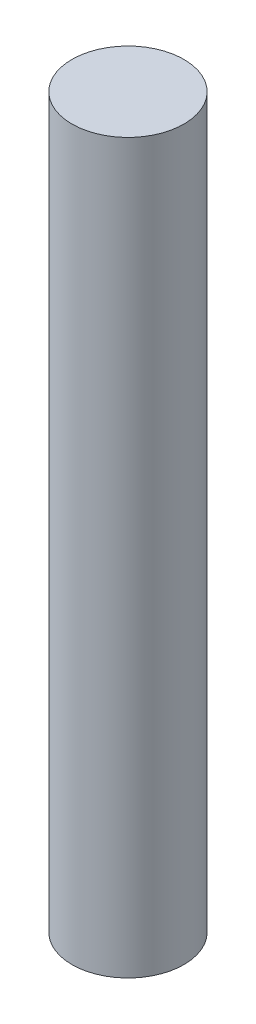
ISO-10303-21;
HEADER;
FILE_DESCRIPTION(('STEP AP214'),'2;1');
FILE_NAME('part.step','',(''),(''),'','','');
FILE_SCHEMA(('AUTOMOTIVE_DESIGN { 1 0 10303 214 1 1 1 1 }'));
ENDSEC;
DATA;
#1=APPLICATION_CONTEXT('core data for automotive mechanical design processes');
#2=APPLICATION_PROTOCOL_DEFINITION('international standard','automotive_design',2000,#1);
#3=PRODUCT_CONTEXT('',#1,'mechanical');
#4=PRODUCT('Part','Part','',(#3));
#5=PRODUCT_RELATED_PRODUCT_CATEGORY('part','',(#4));
#6=PRODUCT_DEFINITION_FORMATION('','',#4);
#7=PRODUCT_DEFINITION_CONTEXT('part definition',#1,'design');
#8=PRODUCT_DEFINITION('design','',#6,#7);
#9=PRODUCT_DEFINITION_SHAPE('','',#8);
#10=(LENGTH_UNIT() NAMED_UNIT(*) SI_UNIT(.MILLI.,.METRE.));
#11=(NAMED_UNIT(*) PLANE_ANGLE_UNIT() SI_UNIT($,.RADIAN.));
#12=(NAMED_UNIT(*) SI_UNIT($,.STERADIAN.) SOLID_ANGLE_UNIT());
#13=UNCERTAINTY_MEASURE_WITH_UNIT(LENGTH_MEASURE(1.E-05),#10,'distance_accuracy_value','');
#14=(GEOMETRIC_REPRESENTATION_CONTEXT(3) GLOBAL_UNCERTAINTY_ASSIGNED_CONTEXT((#13)) GLOBAL_UNIT_ASSIGNED_CONTEXT((#10,
#11,#12)) REPRESENTATION_CONTEXT('',''));
#15=CARTESIAN_POINT('',(0.,0.,0.));
#16=DIRECTION('',(0.,0.,1.));
#17=DIRECTION('',(1.,0.,0.));
#18=AXIS2_PLACEMENT_3D('',#15,#16,#17);
#19=CARTESIAN_POINT('',(0.,32.5,0.));
#20=DIRECTION('',(0.,-1.,0.));
#21=DIRECTION('',(0.,0.,-1.));
#22=AXIS2_PLACEMENT_3D('',#19,#20,#21);
#23=CYLINDRICAL_SURFACE('',#22,5.);
#24=CARTESIAN_POINT('',(0.,32.5,0.));
#25=DIRECTION('',(0.,1.,0.));
#26=DIRECTION('',(0.,0.,1.));
#27=AXIS2_PLACEMENT_3D('',#24,#25,#26);
#28=CIRCLE('',#27,5.);
#29=CARTESIAN_POINT('',(0.,32.5,5.));
#30=VERTEX_POINT('',#29);
#31=EDGE_CURVE('E10',#30,#30,#28,.T.);
#32=ORIENTED_EDGE('',*,*,#31,.F.);
#33=EDGE_LOOP('',(#32));
#34=FACE_BOUND('',#33,.T.);
#35=CARTESIAN_POINT('',(0.,-32.5,0.));
#36=DIRECTION('',(0.,1.,0.));
#37=DIRECTION('',(0.,0.,1.));
#38=AXIS2_PLACEMENT_3D('',#35,#36,#37);
#39=CIRCLE('',#38,5.);
#40=CARTESIAN_POINT('',(0.,-32.5,5.));
#41=VERTEX_POINT('',#40);
#42=EDGE_CURVE('E37',#41,#41,#39,.T.);
#43=ORIENTED_EDGE('',*,*,#42,.T.);
#44=EDGE_LOOP('',(#43));
#45=FACE_BOUND('',#44,.T.);
#46=ADVANCED_FACE('F34',(#34,#45),#23,.T.);
#47=CARTESIAN_POINT('',(0.,32.5,0.));
#48=DIRECTION('',(0.,1.,0.));
#49=DIRECTION('',(0.,0.,1.));
#50=AXIS2_PLACEMENT_3D('',#47,#48,#49);
#51=PLANE('',#50);
#52=ORIENTED_EDGE('',*,*,#31,.T.);
#53=EDGE_LOOP('',(#52));
#54=FACE_BOUND('',#53,.T.);
#55=ADVANCED_FACE('F49',(#54),#51,.T.);
#56=CARTESIAN_POINT('',(0.,-32.5,0.));
#57=DIRECTION('',(0.,1.,0.));
#58=DIRECTION('',(0.,0.,1.));
#59=AXIS2_PLACEMENT_3D('',#56,#57,#58);
#60=PLANE('',#59);
#61=ORIENTED_EDGE('',*,*,#42,.F.);
#62=EDGE_LOOP('',(#61));
#63=FACE_BOUND('',#62,.T.);
#64=ADVANCED_FACE('F47',(#63),#60,.F.);
#65=CLOSED_SHELL('',(#46,#55,#64));
#66=MANIFOLD_SOLID_BREP('B2',#65);
#67=ADVANCED_BREP_SHAPE_REPRESENTATION('',(#18,#66),#14);
#68=SHAPE_DEFINITION_REPRESENTATION(#9,#67);
ENDSEC;
END-ISO-10303-21;
